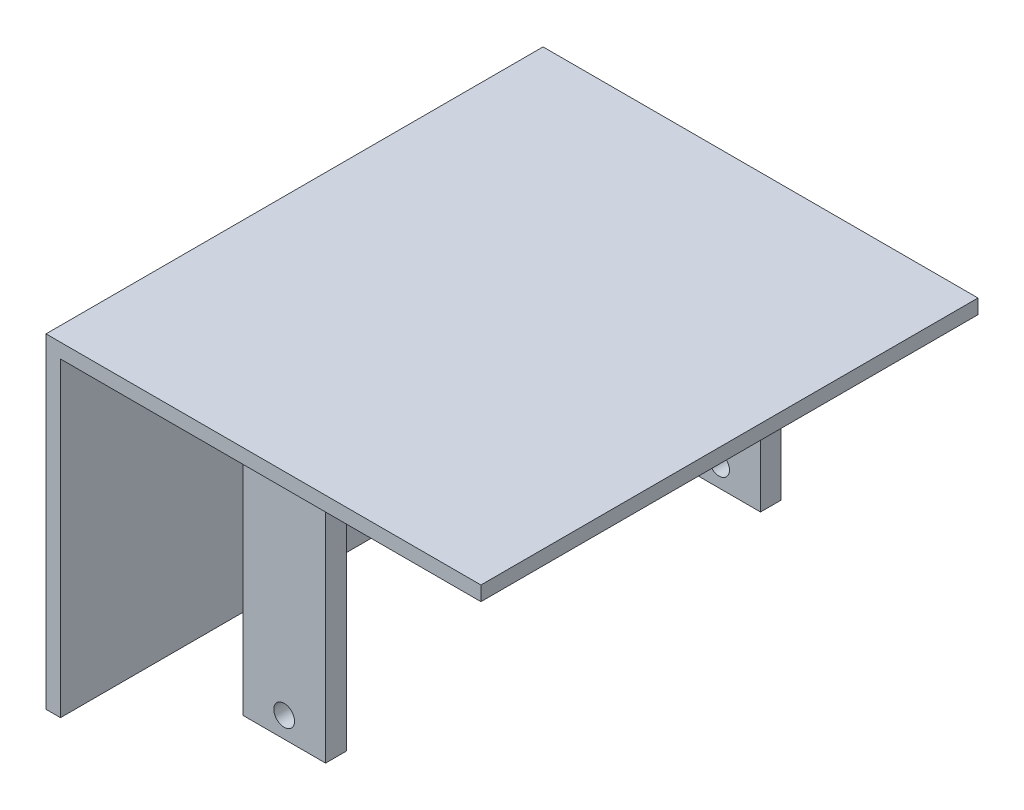
ISO-10303-21;
HEADER;
FILE_DESCRIPTION(('STEP AP214'),'2;1');
FILE_NAME('part.step','',(''),(''),'','','');
FILE_SCHEMA(('AUTOMOTIVE_DESIGN { 1 0 10303 214 1 1 1 1 }'));
ENDSEC;
DATA;
#1=APPLICATION_CONTEXT('core data for automotive mechanical design processes');
#2=APPLICATION_PROTOCOL_DEFINITION('international standard','automotive_design',2000,#1);
#3=PRODUCT_CONTEXT('',#1,'mechanical');
#4=PRODUCT('Part','Part','',(#3));
#5=PRODUCT_RELATED_PRODUCT_CATEGORY('part','',(#4));
#6=PRODUCT_DEFINITION_FORMATION('','',#4);
#7=PRODUCT_DEFINITION_CONTEXT('part definition',#1,'design');
#8=PRODUCT_DEFINITION('design','',#6,#7);
#9=PRODUCT_DEFINITION_SHAPE('','',#8);
#10=(LENGTH_UNIT() NAMED_UNIT(*) SI_UNIT(.MILLI.,.METRE.));
#11=(NAMED_UNIT(*) PLANE_ANGLE_UNIT() SI_UNIT($,.RADIAN.));
#12=(NAMED_UNIT(*) SI_UNIT($,.STERADIAN.) SOLID_ANGLE_UNIT());
#13=UNCERTAINTY_MEASURE_WITH_UNIT(LENGTH_MEASURE(1.E-05),#10,'distance_accuracy_value','');
#14=(GEOMETRIC_REPRESENTATION_CONTEXT(3) GLOBAL_UNCERTAINTY_ASSIGNED_CONTEXT((#13)) GLOBAL_UNIT_ASSIGNED_CONTEXT((#10,
#11,#12)) REPRESENTATION_CONTEXT('',''));
#15=CARTESIAN_POINT('',(0.,0.,0.));
#16=DIRECTION('',(0.,0.,1.));
#17=DIRECTION('',(1.,0.,0.));
#18=AXIS2_PLACEMENT_3D('',#15,#16,#17);
#19=CARTESIAN_POINT('',(0.,17.78,0.));
#20=DIRECTION('',(0.,1.,0.));
#21=DIRECTION('',(0.,0.,1.));
#22=AXIS2_PLACEMENT_3D('',#19,#20,#21);
#23=PLANE('',#22);
#24=DIRECTION('',(0.,0.,-1.));
#25=VECTOR('',#24,1.);
#26=CARTESIAN_POINT('',(266.7,17.78,-304.8));
#27=LINE('',#26,#25);
#28=CARTESIAN_POINT('',(266.7,17.78,304.8));
#29=VERTEX_POINT('',#28);
#30=CARTESIAN_POINT('',(266.7,17.78,-304.8));
#31=VERTEX_POINT('',#30);
#32=EDGE_CURVE('E241',#29,#31,#27,.T.);
#33=ORIENTED_EDGE('',*,*,#32,.T.);
#34=DIRECTION('',(-1.,0.,0.));
#35=VECTOR('',#34,1.);
#36=CARTESIAN_POINT('',(-266.7,17.78,-304.8));
#37=LINE('',#36,#35);
#38=CARTESIAN_POINT('',(-266.7,17.78,-304.8));
#39=VERTEX_POINT('',#38);
#40=EDGE_CURVE('E244',#31,#39,#37,.T.);
#41=ORIENTED_EDGE('',*,*,#40,.T.);
#42=DIRECTION('',(0.,0.,1.));
#43=VECTOR('',#42,1.);
#44=CARTESIAN_POINT('',(-266.7,17.78,-304.8));
#45=LINE('',#44,#43);
#46=CARTESIAN_POINT('',(-266.7,17.78,304.8));
#47=VERTEX_POINT('',#46);
#48=EDGE_CURVE('E141',#39,#47,#45,.T.);
#49=ORIENTED_EDGE('',*,*,#48,.T.);
#50=DIRECTION('',(1.,0.,0.));
#51=VECTOR('',#50,1.);
#52=CARTESIAN_POINT('',(-266.7,17.78,304.8));
#53=LINE('',#52,#51);
#54=EDGE_CURVE('E248',#47,#29,#53,.T.);
#55=ORIENTED_EDGE('',*,*,#54,.T.);
#56=EDGE_LOOP('',(#33,#41,#49,#55));
#57=FACE_BOUND('',#56,.T.);
#58=ADVANCED_FACE('F34',(#57),#23,.T.);
#59=CARTESIAN_POINT('',(0.,0.,0.));
#60=DIRECTION('',(0.,1.,0.));
#61=DIRECTION('',(0.,0.,1.));
#62=AXIS2_PLACEMENT_3D('',#59,#60,#61);
#63=PLANE('',#62);
#64=DIRECTION('',(0.,0.,1.));
#65=VECTOR('',#64,1.);
#66=CARTESIAN_POINT('',(-50.8,0.,-279.4));
#67=LINE('',#66,#65);
#68=CARTESIAN_POINT('',(-50.8,0.,-279.4));
#69=VERTEX_POINT('',#68);
#70=CARTESIAN_POINT('',(-50.8,0.,-254.));
#71=VERTEX_POINT('',#70);
#72=EDGE_CURVE('E182',#69,#71,#67,.T.);
#73=ORIENTED_EDGE('',*,*,#72,.T.);
#74=DIRECTION('',(1.,0.,0.));
#75=VECTOR('',#74,1.);
#76=CARTESIAN_POINT('',(-50.8,0.,-254.));
#77=LINE('',#76,#75);
#78=CARTESIAN_POINT('',(50.8,0.,-254.));
#79=VERTEX_POINT('',#78);
#80=EDGE_CURVE('E177',#71,#79,#77,.T.);
#81=ORIENTED_EDGE('',*,*,#80,.T.);
#82=DIRECTION('',(0.,0.,-1.));
#83=VECTOR('',#82,1.);
#84=CARTESIAN_POINT('',(50.8,0.,-254.));
#85=LINE('',#84,#83);
#86=CARTESIAN_POINT('',(50.8,0.,-279.4));
#87=VERTEX_POINT('',#86);
#88=EDGE_CURVE('E194',#79,#87,#85,.T.);
#89=ORIENTED_EDGE('',*,*,#88,.T.);
#90=DIRECTION('',(-1.,0.,0.));
#91=VECTOR('',#90,1.);
#92=CARTESIAN_POINT('',(50.8,0.,-279.4));
#93=LINE('',#92,#91);
#94=EDGE_CURVE('E58',#87,#69,#93,.T.);
#95=ORIENTED_EDGE('',*,*,#94,.T.);
#96=EDGE_LOOP('',(#73,#81,#89,#95));
#97=FACE_BOUND('',#96,.T.);
#98=DIRECTION('',(0.,0.,1.));
#99=VECTOR('',#98,1.);
#100=CARTESIAN_POINT('',(-50.7999999999999,0.,254.));
#101=LINE('',#100,#99);
#102=CARTESIAN_POINT('',(-50.7999999999999,0.,254.));
#103=VERTEX_POINT('',#102);
#104=CARTESIAN_POINT('',(-50.7999999999999,0.,279.4));
#105=VERTEX_POINT('',#104);
#106=EDGE_CURVE('E212',#103,#105,#101,.T.);
#107=ORIENTED_EDGE('',*,*,#106,.T.);
#108=DIRECTION('',(1.,0.,0.));
#109=VECTOR('',#108,1.);
#110=CARTESIAN_POINT('',(-50.7999999999999,0.,279.4));
#111=LINE('',#110,#109);
#112=CARTESIAN_POINT('',(50.8000000000001,0.,279.4));
#113=VERTEX_POINT('',#112);
#114=EDGE_CURVE('E202',#105,#113,#111,.T.);
#115=ORIENTED_EDGE('',*,*,#114,.T.);
#116=DIRECTION('',(0.,0.,-1.));
#117=VECTOR('',#116,1.);
#118=CARTESIAN_POINT('',(50.8000000000001,0.,279.4));
#119=LINE('',#118,#117);
#120=CARTESIAN_POINT('',(50.8000000000001,0.,254.));
#121=VERTEX_POINT('',#120);
#122=EDGE_CURVE('E224',#113,#121,#119,.T.);
#123=ORIENTED_EDGE('',*,*,#122,.T.);
#124=DIRECTION('',(-1.,0.,0.));
#125=VECTOR('',#124,1.);
#126=CARTESIAN_POINT('',(50.8000000000001,0.,254.));
#127=LINE('',#126,#125);
#128=EDGE_CURVE('E227',#121,#103,#127,.T.);
#129=ORIENTED_EDGE('',*,*,#128,.T.);
#130=EDGE_LOOP('',(#107,#115,#123,#129));
#131=FACE_BOUND('',#130,.T.);
#132=DIRECTION('',(1.,0.,0.));
#133=VECTOR('',#132,1.);
#134=CARTESIAN_POINT('',(-266.7,0.,304.8));
#135=LINE('',#134,#133);
#136=CARTESIAN_POINT('',(-248.92,0.,304.8));
#137=VERTEX_POINT('',#136);
#138=CARTESIAN_POINT('',(266.7,0.,304.8));
#139=VERTEX_POINT('',#138);
#140=EDGE_CURVE('E245',#137,#139,#135,.T.);
#141=ORIENTED_EDGE('',*,*,#140,.F.);
#142=DIRECTION('',(0.,0.,-1.));
#143=VECTOR('',#142,1.);
#144=CARTESIAN_POINT('',(-248.92,0.,-304.8));
#145=LINE('',#144,#143);
#146=CARTESIAN_POINT('',(-248.92,0.,-304.8));
#147=VERTEX_POINT('',#146);
#148=EDGE_CURVE('E50',#137,#147,#145,.T.);
#149=ORIENTED_EDGE('',*,*,#148,.T.);
#150=DIRECTION('',(-1.,0.,0.));
#151=VECTOR('',#150,1.);
#152=CARTESIAN_POINT('',(-266.7,0.,-304.8));
#153=LINE('',#152,#151);
#154=CARTESIAN_POINT('',(266.7,0.,-304.8));
#155=VERTEX_POINT('',#154);
#156=EDGE_CURVE('E253',#155,#147,#153,.T.);
#157=ORIENTED_EDGE('',*,*,#156,.F.);
#158=DIRECTION('',(0.,0.,-1.));
#159=VECTOR('',#158,1.);
#160=CARTESIAN_POINT('',(266.7,0.,-304.8));
#161=LINE('',#160,#159);
#162=EDGE_CURVE('E234',#139,#155,#161,.T.);
#163=ORIENTED_EDGE('',*,*,#162,.F.);
#164=EDGE_LOOP('',(#141,#149,#157,#163));
#165=FACE_BOUND('',#164,.T.);
#166=ADVANCED_FACE('F269',(#97,#131,#165),#63,.F.);
#167=CARTESIAN_POINT('',(266.7,17.78,-304.8));
#168=DIRECTION('',(-1.,0.,0.));
#169=DIRECTION('',(0.,0.,1.));
#170=AXIS2_PLACEMENT_3D('',#167,#168,#169);
#171=PLANE('',#170);
#172=ORIENTED_EDGE('',*,*,#162,.T.);
#173=DIRECTION('',(0.,-1.,0.));
#174=VECTOR('',#173,1.);
#175=CARTESIAN_POINT('',(266.7,17.78,-304.8));
#176=LINE('',#175,#174);
#177=EDGE_CURVE('E11',#31,#155,#176,.T.);
#178=ORIENTED_EDGE('',*,*,#177,.F.);
#179=ORIENTED_EDGE('',*,*,#32,.F.);
#180=DIRECTION('',(0.,-1.,0.));
#181=VECTOR('',#180,1.);
#182=CARTESIAN_POINT('',(266.7,17.78,304.8));
#183=LINE('',#182,#181);
#184=EDGE_CURVE('E250',#29,#139,#183,.T.);
#185=ORIENTED_EDGE('',*,*,#184,.T.);
#186=EDGE_LOOP('',(#172,#178,#179,#185));
#187=FACE_BOUND('',#186,.T.);
#188=ADVANCED_FACE('F36',(#187),#171,.F.);
#189=CARTESIAN_POINT('',(-266.7,17.78,-304.8));
#190=DIRECTION('',(0.,0.,1.));
#191=DIRECTION('',(1.,0.,0.));
#192=AXIS2_PLACEMENT_3D('',#189,#190,#191);
#193=PLANE('',#192);
#194=ORIENTED_EDGE('',*,*,#156,.T.);
#195=DIRECTION('',(0.,1.,0.));
#196=VECTOR('',#195,1.);
#197=CARTESIAN_POINT('',(-248.92,-381.,-304.8));
#198=LINE('',#197,#196);
#199=CARTESIAN_POINT('',(-248.92,-381.,-304.8));
#200=VERTEX_POINT('',#199);
#201=EDGE_CURVE('E158',#200,#147,#198,.T.);
#202=ORIENTED_EDGE('',*,*,#201,.F.);
#203=DIRECTION('',(-1.,0.,0.));
#204=VECTOR('',#203,1.);
#205=CARTESIAN_POINT('',(-266.7,-381.,-304.8));
#206=LINE('',#205,#204);
#207=CARTESIAN_POINT('',(-266.7,-381.,-304.8));
#208=VERTEX_POINT('',#207);
#209=EDGE_CURVE('E151',#200,#208,#206,.T.);
#210=ORIENTED_EDGE('',*,*,#209,.T.);
#211=DIRECTION('',(0.,-1.,0.));
#212=VECTOR('',#211,1.);
#213=CARTESIAN_POINT('',(-266.7,17.78,-304.8));
#214=LINE('',#213,#212);
#215=EDGE_CURVE('E43',#39,#208,#214,.T.);
#216=ORIENTED_EDGE('',*,*,#215,.F.);
#217=ORIENTED_EDGE('',*,*,#40,.F.);
#218=ORIENTED_EDGE('',*,*,#177,.T.);
#219=EDGE_LOOP('',(#194,#202,#210,#216,#217,#218));
#220=FACE_BOUND('',#219,.T.);
#221=ADVANCED_FACE('F157',(#220),#193,.F.);
#222=CARTESIAN_POINT('',(-266.7,17.78,-304.8));
#223=DIRECTION('',(1.,0.,0.));
#224=DIRECTION('',(0.,0.,-1.));
#225=AXIS2_PLACEMENT_3D('',#222,#223,#224);
#226=PLANE('',#225);
#227=ORIENTED_EDGE('',*,*,#215,.T.);
#228=DIRECTION('',(0.,0.,1.));
#229=VECTOR('',#228,1.);
#230=CARTESIAN_POINT('',(-266.7,-381.,-304.8));
#231=LINE('',#230,#229);
#232=CARTESIAN_POINT('',(-266.7,-381.,304.8));
#233=VERTEX_POINT('',#232);
#234=EDGE_CURVE('E140',#208,#233,#231,.T.);
#235=ORIENTED_EDGE('',*,*,#234,.T.);
#236=DIRECTION('',(0.,-1.,0.));
#237=VECTOR('',#236,1.);
#238=CARTESIAN_POINT('',(-266.7,17.78,304.8));
#239=LINE('',#238,#237);
#240=EDGE_CURVE('E144',#47,#233,#239,.T.);
#241=ORIENTED_EDGE('',*,*,#240,.F.);
#242=ORIENTED_EDGE('',*,*,#48,.F.);
#243=EDGE_LOOP('',(#227,#235,#241,#242));
#244=FACE_BOUND('',#243,.T.);
#245=ADVANCED_FACE('F138',(#244),#226,.F.);
#246=CARTESIAN_POINT('',(-266.7,17.78,304.8));
#247=DIRECTION('',(0.,0.,-1.));
#248=DIRECTION('',(-1.,0.,0.));
#249=AXIS2_PLACEMENT_3D('',#246,#247,#248);
#250=PLANE('',#249);
#251=ORIENTED_EDGE('',*,*,#240,.T.);
#252=DIRECTION('',(1.,0.,0.));
#253=VECTOR('',#252,1.);
#254=CARTESIAN_POINT('',(-248.92,-381.,304.8));
#255=LINE('',#254,#253);
#256=CARTESIAN_POINT('',(-248.92,-381.,304.8));
#257=VERTEX_POINT('',#256);
#258=EDGE_CURVE('E154',#233,#257,#255,.T.);
#259=ORIENTED_EDGE('',*,*,#258,.T.);
#260=DIRECTION('',(0.,1.,0.));
#261=VECTOR('',#260,1.);
#262=CARTESIAN_POINT('',(-248.92,-381.,304.8));
#263=LINE('',#262,#261);
#264=EDGE_CURVE('E164',#257,#137,#263,.T.);
#265=ORIENTED_EDGE('',*,*,#264,.T.);
#266=ORIENTED_EDGE('',*,*,#140,.T.);
#267=ORIENTED_EDGE('',*,*,#184,.F.);
#268=ORIENTED_EDGE('',*,*,#54,.F.);
#269=EDGE_LOOP('',(#251,#259,#265,#266,#267,#268));
#270=FACE_BOUND('',#269,.T.);
#271=ADVANCED_FACE('F260',(#270),#250,.F.);
#272=CARTESIAN_POINT('',(-50.7999999999999,-292.1,279.4));
#273=DIRECTION('',(0.,0.,1.));
#274=DIRECTION('',(1.,0.,0.));
#275=AXIS2_PLACEMENT_3D('',#272,#273,#274);
#276=PLANE('',#275);
#277=CARTESIAN_POINT('',(0.,-266.7,279.4));
#278=DIRECTION('',(0.,0.,1.));
#279=DIRECTION('',(1.,0.,0.));
#280=AXIS2_PLACEMENT_3D('',#277,#278,#279);
#281=CIRCLE('',#280,12.7);
#282=CARTESIAN_POINT('',(12.7,-266.7,279.4));
#283=VERTEX_POINT('',#282);
#284=EDGE_CURVE('E174',#283,#283,#281,.F.);
#285=ORIENTED_EDGE('',*,*,#284,.T.);
#286=EDGE_LOOP('',(#285));
#287=FACE_BOUND('',#286,.T.);
#288=ORIENTED_EDGE('',*,*,#114,.F.);
#289=DIRECTION('',(0.,1.,0.));
#290=VECTOR('',#289,1.);
#291=CARTESIAN_POINT('',(-50.7999999999999,-292.1,279.4));
#292=LINE('',#291,#290);
#293=CARTESIAN_POINT('',(-50.7999999999999,-292.1,279.4));
#294=VERTEX_POINT('',#293);
#295=EDGE_CURVE('E232',#294,#105,#292,.T.);
#296=ORIENTED_EDGE('',*,*,#295,.F.);
#297=DIRECTION('',(1.,0.,0.));
#298=VECTOR('',#297,1.);
#299=CARTESIAN_POINT('',(-50.7999999999999,-292.1,279.4));
#300=LINE('',#299,#298);
#301=CARTESIAN_POINT('',(50.8000000000001,-292.1,279.4));
#302=VERTEX_POINT('',#301);
#303=EDGE_CURVE('E208',#294,#302,#300,.T.);
#304=ORIENTED_EDGE('',*,*,#303,.T.);
#305=DIRECTION('',(0.,1.,0.));
#306=VECTOR('',#305,1.);
#307=CARTESIAN_POINT('',(50.8000000000001,-292.1,279.4));
#308=LINE('',#307,#306);
#309=EDGE_CURVE('E221',#302,#113,#308,.T.);
#310=ORIENTED_EDGE('',*,*,#309,.T.);
#311=EDGE_LOOP('',(#288,#296,#304,#310));
#312=FACE_BOUND('',#311,.T.);
#313=ADVANCED_FACE('F290',(#287,#312),#276,.T.);
#314=CARTESIAN_POINT('',(-50.7999999999999,-292.1,254.));
#315=DIRECTION('',(-1.,0.,0.));
#316=DIRECTION('',(0.,0.,1.));
#317=AXIS2_PLACEMENT_3D('',#314,#315,#316);
#318=PLANE('',#317);
#319=ORIENTED_EDGE('',*,*,#106,.F.);
#320=DIRECTION('',(0.,1.,0.));
#321=VECTOR('',#320,1.);
#322=CARTESIAN_POINT('',(-50.7999999999999,-292.1,254.));
#323=LINE('',#322,#321);
#324=CARTESIAN_POINT('',(-50.7999999999999,-292.1,254.));
#325=VERTEX_POINT('',#324);
#326=EDGE_CURVE('E235',#325,#103,#323,.T.);
#327=ORIENTED_EDGE('',*,*,#326,.F.);
#328=DIRECTION('',(0.,0.,1.));
#329=VECTOR('',#328,1.);
#330=CARTESIAN_POINT('',(-50.7999999999999,-292.1,254.));
#331=LINE('',#330,#329);
#332=EDGE_CURVE('E218',#325,#294,#331,.T.);
#333=ORIENTED_EDGE('',*,*,#332,.T.);
#334=ORIENTED_EDGE('',*,*,#295,.T.);
#335=EDGE_LOOP('',(#319,#327,#333,#334));
#336=FACE_BOUND('',#335,.T.);
#337=ADVANCED_FACE('F349',(#336),#318,.T.);
#338=CARTESIAN_POINT('',(50.8000000000001,-292.1,254.));
#339=DIRECTION('',(0.,0.,-1.));
#340=DIRECTION('',(-1.,0.,0.));
#341=AXIS2_PLACEMENT_3D('',#338,#339,#340);
#342=PLANE('',#341);
#343=CARTESIAN_POINT('',(0.,-266.7,254.));
#344=DIRECTION('',(0.,0.,-1.));
#345=DIRECTION('',(-1.,0.,0.));
#346=AXIS2_PLACEMENT_3D('',#343,#344,#345);
#347=CIRCLE('',#346,12.7);
#348=CARTESIAN_POINT('',(-12.7,-266.7,254.));
#349=VERTEX_POINT('',#348);
#350=EDGE_CURVE('E171',#349,#349,#347,.F.);
#351=ORIENTED_EDGE('',*,*,#350,.T.);
#352=EDGE_LOOP('',(#351));
#353=FACE_BOUND('',#352,.T.);
#354=ORIENTED_EDGE('',*,*,#128,.F.);
#355=DIRECTION('',(0.,1.,0.));
#356=VECTOR('',#355,1.);
#357=CARTESIAN_POINT('',(50.8000000000001,-292.1,254.));
#358=LINE('',#357,#356);
#359=CARTESIAN_POINT('',(50.8000000000001,-292.1,254.));
#360=VERTEX_POINT('',#359);
#361=EDGE_CURVE('E237',#360,#121,#358,.T.);
#362=ORIENTED_EDGE('',*,*,#361,.F.);
#363=DIRECTION('',(-1.,0.,0.));
#364=VECTOR('',#363,1.);
#365=CARTESIAN_POINT('',(50.8000000000001,-292.1,254.));
#366=LINE('',#365,#364);
#367=EDGE_CURVE('E215',#360,#325,#366,.T.);
#368=ORIENTED_EDGE('',*,*,#367,.T.);
#369=ORIENTED_EDGE('',*,*,#326,.T.);
#370=EDGE_LOOP('',(#354,#362,#368,#369));
#371=FACE_BOUND('',#370,.T.);
#372=ADVANCED_FACE('F357',(#353,#371),#342,.T.);
#373=CARTESIAN_POINT('',(50.8000000000001,-292.1,279.4));
#374=DIRECTION('',(1.,0.,0.));
#375=DIRECTION('',(0.,0.,-1.));
#376=AXIS2_PLACEMENT_3D('',#373,#374,#375);
#377=PLANE('',#376);
#378=ORIENTED_EDGE('',*,*,#122,.F.);
#379=ORIENTED_EDGE('',*,*,#309,.F.);
#380=DIRECTION('',(0.,0.,-1.));
#381=VECTOR('',#380,1.);
#382=CARTESIAN_POINT('',(50.8000000000001,-292.1,279.4));
#383=LINE('',#382,#381);
#384=EDGE_CURVE('E211',#302,#360,#383,.T.);
#385=ORIENTED_EDGE('',*,*,#384,.T.);
#386=ORIENTED_EDGE('',*,*,#361,.T.);
#387=EDGE_LOOP('',(#378,#379,#385,#386));
#388=FACE_BOUND('',#387,.T.);
#389=ADVANCED_FACE('F365',(#388),#377,.T.);
#390=CARTESIAN_POINT('',(0.,-292.1,0.));
#391=DIRECTION('',(0.,1.,0.));
#392=DIRECTION('',(0.,0.,1.));
#393=AXIS2_PLACEMENT_3D('',#390,#391,#392);
#394=PLANE('',#393);
#395=ORIENTED_EDGE('',*,*,#303,.F.);
#396=ORIENTED_EDGE('',*,*,#332,.F.);
#397=ORIENTED_EDGE('',*,*,#367,.F.);
#398=ORIENTED_EDGE('',*,*,#384,.F.);
#399=EDGE_LOOP('',(#395,#396,#397,#398));
#400=FACE_BOUND('',#399,.T.);
#401=ADVANCED_FACE('F373',(#400),#394,.F.);
#402=CARTESIAN_POINT('',(-50.8,-292.1,-254.));
#403=DIRECTION('',(0.,0.,1.));
#404=DIRECTION('',(1.,0.,0.));
#405=AXIS2_PLACEMENT_3D('',#402,#403,#404);
#406=PLANE('',#405);
#407=CARTESIAN_POINT('',(0.,-266.7,-254.));
#408=DIRECTION('',(0.,0.,1.));
#409=DIRECTION('',(1.,0.,0.));
#410=AXIS2_PLACEMENT_3D('',#407,#408,#409);
#411=CIRCLE('',#410,12.7);
#412=CARTESIAN_POINT('',(12.7,-266.7,-254.));
#413=VERTEX_POINT('',#412);
#414=EDGE_CURVE('E168',#413,#413,#411,.F.);
#415=ORIENTED_EDGE('',*,*,#414,.T.);
#416=EDGE_LOOP('',(#415));
#417=FACE_BOUND('',#416,.T.);
#418=ORIENTED_EDGE('',*,*,#80,.F.);
#419=DIRECTION('',(0.,1.,0.));
#420=VECTOR('',#419,1.);
#421=CARTESIAN_POINT('',(-50.8,-292.1,-254.));
#422=LINE('',#421,#420);
#423=CARTESIAN_POINT('',(-50.8,-292.1,-254.));
#424=VERTEX_POINT('',#423);
#425=EDGE_CURVE('E200',#424,#71,#422,.T.);
#426=ORIENTED_EDGE('',*,*,#425,.F.);
#427=DIRECTION('',(1.,0.,0.));
#428=VECTOR('',#427,1.);
#429=CARTESIAN_POINT('',(-50.8,-292.1,-254.));
#430=LINE('',#429,#428);
#431=CARTESIAN_POINT('',(50.8,-292.1,-254.));
#432=VERTEX_POINT('',#431);
#433=EDGE_CURVE('E178',#424,#432,#430,.T.);
#434=ORIENTED_EDGE('',*,*,#433,.T.);
#435=DIRECTION('',(0.,1.,0.));
#436=VECTOR('',#435,1.);
#437=CARTESIAN_POINT('',(50.8,-292.1,-254.));
#438=LINE('',#437,#436);
#439=EDGE_CURVE('E191',#432,#79,#438,.T.);
#440=ORIENTED_EDGE('',*,*,#439,.T.);
#441=EDGE_LOOP('',(#418,#426,#434,#440));
#442=FACE_BOUND('',#441,.T.);
#443=ADVANCED_FACE('F380',(#417,#442),#406,.T.);
#444=CARTESIAN_POINT('',(-50.8,-292.1,-279.4));
#445=DIRECTION('',(-1.,0.,0.));
#446=DIRECTION('',(0.,0.,1.));
#447=AXIS2_PLACEMENT_3D('',#444,#445,#446);
#448=PLANE('',#447);
#449=ORIENTED_EDGE('',*,*,#72,.F.);
#450=DIRECTION('',(0.,1.,0.));
#451=VECTOR('',#450,1.);
#452=CARTESIAN_POINT('',(-50.8,-292.1,-279.4));
#453=LINE('',#452,#451);
#454=CARTESIAN_POINT('',(-50.8,-292.1,-279.4));
#455=VERTEX_POINT('',#454);
#456=EDGE_CURVE('E203',#455,#69,#453,.T.);
#457=ORIENTED_EDGE('',*,*,#456,.F.);
#458=DIRECTION('',(0.,0.,1.));
#459=VECTOR('',#458,1.);
#460=CARTESIAN_POINT('',(-50.8,-292.1,-279.4));
#461=LINE('',#460,#459);
#462=EDGE_CURVE('E188',#455,#424,#461,.T.);
#463=ORIENTED_EDGE('',*,*,#462,.T.);
#464=ORIENTED_EDGE('',*,*,#425,.T.);
#465=EDGE_LOOP('',(#449,#457,#463,#464));
#466=FACE_BOUND('',#465,.T.);
#467=ADVANCED_FACE('F388',(#466),#448,.T.);
#468=CARTESIAN_POINT('',(50.8,-292.1,-279.4));
#469=DIRECTION('',(0.,0.,-1.));
#470=DIRECTION('',(-1.,0.,0.));
#471=AXIS2_PLACEMENT_3D('',#468,#469,#470);
#472=PLANE('',#471);
#473=CARTESIAN_POINT('',(0.,-266.7,-279.4));
#474=DIRECTION('',(0.,0.,-1.));
#475=DIRECTION('',(-1.,0.,0.));
#476=AXIS2_PLACEMENT_3D('',#473,#474,#475);
#477=CIRCLE('',#476,12.7);
#478=CARTESIAN_POINT('',(-12.7,-266.7,-279.4));
#479=VERTEX_POINT('',#478);
#480=EDGE_CURVE('E38',#479,#479,#477,.F.);
#481=ORIENTED_EDGE('',*,*,#480,.T.);
#482=EDGE_LOOP('',(#481));
#483=FACE_BOUND('',#482,.T.);
#484=ORIENTED_EDGE('',*,*,#94,.F.);
#485=DIRECTION('',(0.,1.,0.));
#486=VECTOR('',#485,1.);
#487=CARTESIAN_POINT('',(50.8,-292.1,-279.4));
#488=LINE('',#487,#486);
#489=CARTESIAN_POINT('',(50.8,-292.1,-279.4));
#490=VERTEX_POINT('',#489);
#491=EDGE_CURVE('E205',#490,#87,#488,.T.);
#492=ORIENTED_EDGE('',*,*,#491,.F.);
#493=DIRECTION('',(-1.,0.,0.));
#494=VECTOR('',#493,1.);
#495=CARTESIAN_POINT('',(50.8,-292.1,-279.4));
#496=LINE('',#495,#494);
#497=EDGE_CURVE('E185',#490,#455,#496,.T.);
#498=ORIENTED_EDGE('',*,*,#497,.T.);
#499=ORIENTED_EDGE('',*,*,#456,.T.);
#500=EDGE_LOOP('',(#484,#492,#498,#499));
#501=FACE_BOUND('',#500,.T.);
#502=ADVANCED_FACE('F396',(#483,#501),#472,.T.);
#503=CARTESIAN_POINT('',(50.8,-292.1,-254.));
#504=DIRECTION('',(1.,0.,0.));
#505=DIRECTION('',(0.,0.,-1.));
#506=AXIS2_PLACEMENT_3D('',#503,#504,#505);
#507=PLANE('',#506);
#508=ORIENTED_EDGE('',*,*,#88,.F.);
#509=ORIENTED_EDGE('',*,*,#439,.F.);
#510=DIRECTION('',(0.,0.,-1.));
#511=VECTOR('',#510,1.);
#512=CARTESIAN_POINT('',(50.8,-292.1,-254.));
#513=LINE('',#512,#511);
#514=EDGE_CURVE('E181',#432,#490,#513,.T.);
#515=ORIENTED_EDGE('',*,*,#514,.T.);
#516=ORIENTED_EDGE('',*,*,#491,.T.);
#517=EDGE_LOOP('',(#508,#509,#515,#516));
#518=FACE_BOUND('',#517,.T.);
#519=ADVANCED_FACE('F404',(#518),#507,.T.);
#520=CARTESIAN_POINT('',(0.,-292.1,0.));
#521=DIRECTION('',(0.,1.,0.));
#522=DIRECTION('',(0.,0.,1.));
#523=AXIS2_PLACEMENT_3D('',#520,#521,#522);
#524=PLANE('',#523);
#525=ORIENTED_EDGE('',*,*,#433,.F.);
#526=ORIENTED_EDGE('',*,*,#462,.F.);
#527=ORIENTED_EDGE('',*,*,#497,.F.);
#528=ORIENTED_EDGE('',*,*,#514,.F.);
#529=EDGE_LOOP('',(#525,#526,#527,#528));
#530=FACE_BOUND('',#529,.T.);
#531=ADVANCED_FACE('F411',(#530),#524,.F.);
#532=CARTESIAN_POINT('',(0.,-266.7,508.));
#533=DIRECTION('',(0.,0.,-1.));
#534=DIRECTION('',(-1.,0.,0.));
#535=AXIS2_PLACEMENT_3D('',#532,#533,#534);
#536=CYLINDRICAL_SURFACE('',#535,12.7);
#537=ORIENTED_EDGE('',*,*,#414,.F.);
#538=EDGE_LOOP('',(#537));
#539=FACE_BOUND('',#538,.T.);
#540=ORIENTED_EDGE('',*,*,#480,.F.);
#541=EDGE_LOOP('',(#540));
#542=FACE_BOUND('',#541,.T.);
#543=ADVANCED_FACE('F279',(#539,#542),#536,.F.);
#544=ORIENTED_EDGE('',*,*,#284,.F.);
#545=EDGE_LOOP('',(#544));
#546=FACE_BOUND('',#545,.T.);
#547=ORIENTED_EDGE('',*,*,#350,.F.);
#548=EDGE_LOOP('',(#547));
#549=FACE_BOUND('',#548,.T.);
#550=ADVANCED_FACE('F272',(#546,#549),#536,.F.);
#551=CARTESIAN_POINT('',(-248.92,-381.,-304.8));
#552=DIRECTION('',(1.,0.,0.));
#553=DIRECTION('',(0.,0.,-1.));
#554=AXIS2_PLACEMENT_3D('',#551,#552,#553);
#555=PLANE('',#554);
#556=ORIENTED_EDGE('',*,*,#148,.F.);
#557=ORIENTED_EDGE('',*,*,#264,.F.);
#558=DIRECTION('',(0.,0.,-1.));
#559=VECTOR('',#558,1.);
#560=CARTESIAN_POINT('',(-248.92,-381.,-304.8));
#561=LINE('',#560,#559);
#562=EDGE_CURVE('E163',#257,#200,#561,.T.);
#563=ORIENTED_EDGE('',*,*,#562,.T.);
#564=ORIENTED_EDGE('',*,*,#201,.T.);
#565=EDGE_LOOP('',(#556,#557,#563,#564));
#566=FACE_BOUND('',#565,.T.);
#567=ADVANCED_FACE('F270',(#566),#555,.T.);
#568=CARTESIAN_POINT('',(0.,-381.,0.));
#569=DIRECTION('',(0.,-1.,0.));
#570=DIRECTION('',(0.,0.,-1.));
#571=AXIS2_PLACEMENT_3D('',#568,#569,#570);
#572=PLANE('',#571);
#573=ORIENTED_EDGE('',*,*,#209,.F.);
#574=ORIENTED_EDGE('',*,*,#562,.F.);
#575=ORIENTED_EDGE('',*,*,#258,.F.);
#576=ORIENTED_EDGE('',*,*,#234,.F.);
#577=EDGE_LOOP('',(#573,#574,#575,#576));
#578=FACE_BOUND('',#577,.T.);
#579=ADVANCED_FACE('F149',(#578),#572,.T.);
#580=CLOSED_SHELL('',(#58,#166,#188,#221,#245,#271,#313,#337,#372,#389,#401,#443,#467,#502,#519,
#531,#543,#550,#567,#579));
#581=MANIFOLD_SOLID_BREP('B2',#580);
#582=ADVANCED_BREP_SHAPE_REPRESENTATION('',(#18,#581),#14);
#583=SHAPE_DEFINITION_REPRESENTATION(#9,#582);
ENDSEC;
END-ISO-10303-21;
